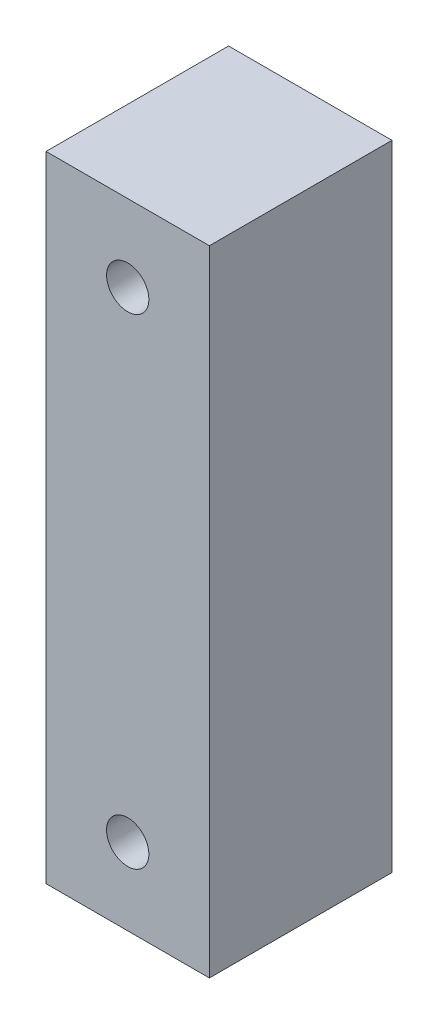
ISO-10303-21;
HEADER;
FILE_DESCRIPTION(('STEP AP214'),'2;1');
FILE_NAME('part.step','',(''),(''),'','','');
FILE_SCHEMA(('AUTOMOTIVE_DESIGN { 1 0 10303 214 1 1 1 1 }'));
ENDSEC;
DATA;
#1=APPLICATION_CONTEXT('core data for automotive mechanical design processes');
#2=APPLICATION_PROTOCOL_DEFINITION('international standard','automotive_design',2000,#1);
#3=PRODUCT_CONTEXT('',#1,'mechanical');
#4=PRODUCT('Part','Part','',(#3));
#5=PRODUCT_RELATED_PRODUCT_CATEGORY('part','',(#4));
#6=PRODUCT_DEFINITION_FORMATION('','',#4);
#7=PRODUCT_DEFINITION_CONTEXT('part definition',#1,'design');
#8=PRODUCT_DEFINITION('design','',#6,#7);
#9=PRODUCT_DEFINITION_SHAPE('','',#8);
#10=(LENGTH_UNIT() NAMED_UNIT(*) SI_UNIT(.MILLI.,.METRE.));
#11=(NAMED_UNIT(*) PLANE_ANGLE_UNIT() SI_UNIT($,.RADIAN.));
#12=(NAMED_UNIT(*) SI_UNIT($,.STERADIAN.) SOLID_ANGLE_UNIT());
#13=UNCERTAINTY_MEASURE_WITH_UNIT(LENGTH_MEASURE(1.E-05),#10,'distance_accuracy_value','');
#14=(GEOMETRIC_REPRESENTATION_CONTEXT(3) GLOBAL_UNCERTAINTY_ASSIGNED_CONTEXT((#13)) GLOBAL_UNIT_ASSIGNED_CONTEXT((#10,
#11,#12)) REPRESENTATION_CONTEXT('',''));
#15=CARTESIAN_POINT('',(0.,0.,0.));
#16=DIRECTION('',(0.,0.,1.));
#17=DIRECTION('',(1.,0.,0.));
#18=AXIS2_PLACEMENT_3D('',#15,#16,#17);
#19=CARTESIAN_POINT('',(85.,165.,-83.5));
#20=DIRECTION('',(0.,-1.,0.));
#21=DIRECTION('',(0.,0.,-1.));
#22=AXIS2_PLACEMENT_3D('',#19,#20,#21);
#23=PLANE('',#22);
#24=DIRECTION('',(0.,0.,1.));
#25=VECTOR('',#24,1.);
#26=CARTESIAN_POINT('',(0.,165.,-83.5));
#27=LINE('',#26,#25);
#28=CARTESIAN_POINT('',(0.,165.,-83.5));
#29=VERTEX_POINT('',#28);
#30=CARTESIAN_POINT('',(0.,165.,11.5));
#31=VERTEX_POINT('',#30);
#32=EDGE_CURVE('E107',#29,#31,#27,.T.);
#33=ORIENTED_EDGE('',*,*,#32,.T.);
#34=DIRECTION('',(-1.,0.,0.));
#35=VECTOR('',#34,1.);
#36=CARTESIAN_POINT('',(85.,165.,11.5));
#37=LINE('',#36,#35);
#38=CARTESIAN_POINT('',(85.,165.,11.5));
#39=VERTEX_POINT('',#38);
#40=EDGE_CURVE('E11',#39,#31,#37,.T.);
#41=ORIENTED_EDGE('',*,*,#40,.F.);
#42=DIRECTION('',(0.,0.,1.));
#43=VECTOR('',#42,1.);
#44=CARTESIAN_POINT('',(85.,165.,-83.5));
#45=LINE('',#44,#43);
#46=CARTESIAN_POINT('',(85.,165.,-83.5));
#47=VERTEX_POINT('',#46);
#48=EDGE_CURVE('E94',#47,#39,#45,.T.);
#49=ORIENTED_EDGE('',*,*,#48,.F.);
#50=DIRECTION('',(-1.,0.,0.));
#51=VECTOR('',#50,1.);
#52=CARTESIAN_POINT('',(85.,165.,-83.5));
#53=LINE('',#52,#51);
#54=EDGE_CURVE('E103',#47,#29,#53,.T.);
#55=ORIENTED_EDGE('',*,*,#54,.T.);
#56=EDGE_LOOP('',(#33,#41,#49,#55));
#57=FACE_BOUND('',#56,.T.);
#58=ADVANCED_FACE('F41',(#57),#23,.F.);
#59=CARTESIAN_POINT('',(85.,-165.,11.5));
#60=DIRECTION('',(0.,0.,-1.));
#61=DIRECTION('',(-1.,0.,0.));
#62=AXIS2_PLACEMENT_3D('',#59,#60,#61);
#63=PLANE('',#62);
#64=CARTESIAN_POINT('',(42.5,125.,11.5));
#65=DIRECTION('',(0.,0.,1.));
#66=DIRECTION('',(1.,0.,0.));
#67=AXIS2_PLACEMENT_3D('',#64,#65,#66);
#68=CIRCLE('',#67,11.);
#69=CARTESIAN_POINT('',(53.5,125.,11.5));
#70=VERTEX_POINT('',#69);
#71=EDGE_CURVE('E116',#70,#70,#68,.T.);
#72=ORIENTED_EDGE('',*,*,#71,.F.);
#73=EDGE_LOOP('',(#72));
#74=FACE_BOUND('',#73,.T.);
#75=CARTESIAN_POINT('',(42.5,-125.,11.5));
#76=DIRECTION('',(0.,0.,1.));
#77=DIRECTION('',(-1.,0.,0.));
#78=AXIS2_PLACEMENT_3D('',#75,#76,#77);
#79=CIRCLE('',#78,11.);
#80=CARTESIAN_POINT('',(31.5,-125.,11.5));
#81=VERTEX_POINT('',#80);
#82=EDGE_CURVE('E121',#81,#81,#79,.T.);
#83=ORIENTED_EDGE('',*,*,#82,.F.);
#84=EDGE_LOOP('',(#83));
#85=FACE_BOUND('',#84,.T.);
#86=DIRECTION('',(0.,-1.,0.));
#87=VECTOR('',#86,1.);
#88=CARTESIAN_POINT('',(0.,-165.,11.5));
#89=LINE('',#88,#87);
#90=CARTESIAN_POINT('',(0.,-165.,11.5));
#91=VERTEX_POINT('',#90);
#92=EDGE_CURVE('E98',#31,#91,#89,.T.);
#93=ORIENTED_EDGE('',*,*,#92,.T.);
#94=DIRECTION('',(-1.,0.,0.));
#95=VECTOR('',#94,1.);
#96=CARTESIAN_POINT('',(85.,-165.,11.5));
#97=LINE('',#96,#95);
#98=CARTESIAN_POINT('',(85.,-165.,11.5));
#99=VERTEX_POINT('',#98);
#100=EDGE_CURVE('E50',#99,#91,#97,.T.);
#101=ORIENTED_EDGE('',*,*,#100,.F.);
#102=DIRECTION('',(0.,-1.,0.));
#103=VECTOR('',#102,1.);
#104=CARTESIAN_POINT('',(85.,-165.,11.5));
#105=LINE('',#104,#103);
#106=EDGE_CURVE('E89',#39,#99,#105,.T.);
#107=ORIENTED_EDGE('',*,*,#106,.F.);
#108=ORIENTED_EDGE('',*,*,#40,.T.);
#109=EDGE_LOOP('',(#93,#101,#107,#108));
#110=FACE_BOUND('',#109,.T.);
#111=ADVANCED_FACE('F97',(#74,#85,#110),#63,.F.);
#112=CARTESIAN_POINT('',(85.,-165.,-83.4999999999999));
#113=DIRECTION('',(0.,1.,0.));
#114=DIRECTION('',(0.,0.,1.));
#115=AXIS2_PLACEMENT_3D('',#112,#113,#114);
#116=PLANE('',#115);
#117=DIRECTION('',(0.,0.,-1.));
#118=VECTOR('',#117,1.);
#119=CARTESIAN_POINT('',(0.,-165.,-83.4999999999999));
#120=LINE('',#119,#118);
#121=CARTESIAN_POINT('',(0.,-165.,-83.4999999999999));
#122=VERTEX_POINT('',#121);
#123=EDGE_CURVE('E76',#91,#122,#120,.T.);
#124=ORIENTED_EDGE('',*,*,#123,.T.);
#125=DIRECTION('',(-1.,0.,0.));
#126=VECTOR('',#125,1.);
#127=CARTESIAN_POINT('',(85.,-165.,-83.4999999999999));
#128=LINE('',#127,#126);
#129=CARTESIAN_POINT('',(85.,-165.,-83.4999999999999));
#130=VERTEX_POINT('',#129);
#131=EDGE_CURVE('E99',#130,#122,#128,.T.);
#132=ORIENTED_EDGE('',*,*,#131,.F.);
#133=DIRECTION('',(0.,0.,-1.));
#134=VECTOR('',#133,1.);
#135=CARTESIAN_POINT('',(85.,-165.,-83.4999999999999));
#136=LINE('',#135,#134);
#137=EDGE_CURVE('E92',#99,#130,#136,.T.);
#138=ORIENTED_EDGE('',*,*,#137,.F.);
#139=ORIENTED_EDGE('',*,*,#100,.T.);
#140=EDGE_LOOP('',(#124,#132,#138,#139));
#141=FACE_BOUND('',#140,.T.);
#142=ADVANCED_FACE('F101',(#141),#116,.F.);
#143=CARTESIAN_POINT('',(85.,-165.,-83.4999999999999));
#144=DIRECTION('',(0.,0.,1.));
#145=DIRECTION('',(0.,-1.,0.));
#146=AXIS2_PLACEMENT_3D('',#143,#144,#145);
#147=PLANE('',#146);
#148=CARTESIAN_POINT('',(42.5,125.,-83.5));
#149=DIRECTION('',(0.,0.,1.));
#150=DIRECTION('',(0.,-1.,0.));
#151=AXIS2_PLACEMENT_3D('',#148,#149,#150);
#152=CIRCLE('',#151,11.);
#153=CARTESIAN_POINT('',(42.5,114.,-83.5));
#154=VERTEX_POINT('',#153);
#155=EDGE_CURVE('E44',#154,#154,#152,.T.);
#156=ORIENTED_EDGE('',*,*,#155,.T.);
#157=EDGE_LOOP('',(#156));
#158=FACE_BOUND('',#157,.T.);
#159=CARTESIAN_POINT('',(42.5,-125.,-83.5));
#160=DIRECTION('',(0.,0.,1.));
#161=DIRECTION('',(0.,-1.,0.));
#162=AXIS2_PLACEMENT_3D('',#159,#160,#161);
#163=CIRCLE('',#162,11.);
#164=CARTESIAN_POINT('',(42.5,-136.,-83.5));
#165=VERTEX_POINT('',#164);
#166=EDGE_CURVE('E114',#165,#165,#163,.T.);
#167=ORIENTED_EDGE('',*,*,#166,.T.);
#168=EDGE_LOOP('',(#167));
#169=FACE_BOUND('',#168,.T.);
#170=DIRECTION('',(0.,1.,0.));
#171=VECTOR('',#170,1.);
#172=CARTESIAN_POINT('',(0.,-165.,-83.4999999999999));
#173=LINE('',#172,#171);
#174=EDGE_CURVE('E82',#122,#29,#173,.T.);
#175=ORIENTED_EDGE('',*,*,#174,.T.);
#176=ORIENTED_EDGE('',*,*,#54,.F.);
#177=DIRECTION('',(0.,1.,0.));
#178=VECTOR('',#177,1.);
#179=CARTESIAN_POINT('',(85.,-165.,-83.4999999999999));
#180=LINE('',#179,#178);
#181=EDGE_CURVE('E59',#130,#47,#180,.T.);
#182=ORIENTED_EDGE('',*,*,#181,.F.);
#183=ORIENTED_EDGE('',*,*,#131,.T.);
#184=EDGE_LOOP('',(#175,#176,#182,#183));
#185=FACE_BOUND('',#184,.T.);
#186=ADVANCED_FACE('F139',(#158,#169,#185),#147,.F.);
#187=CARTESIAN_POINT('',(85.,0.,0.));
#188=DIRECTION('',(-1.,0.,0.));
#189=DIRECTION('',(0.,0.,1.));
#190=AXIS2_PLACEMENT_3D('',#187,#188,#189);
#191=PLANE('',#190);
#192=ORIENTED_EDGE('',*,*,#48,.T.);
#193=ORIENTED_EDGE('',*,*,#106,.T.);
#194=ORIENTED_EDGE('',*,*,#137,.T.);
#195=ORIENTED_EDGE('',*,*,#181,.T.);
#196=EDGE_LOOP('',(#192,#193,#194,#195));
#197=FACE_BOUND('',#196,.T.);
#198=ADVANCED_FACE('F90',(#197),#191,.F.);
#199=CARTESIAN_POINT('',(0.,0.,0.));
#200=DIRECTION('',(-1.,0.,0.));
#201=DIRECTION('',(0.,0.,1.));
#202=AXIS2_PLACEMENT_3D('',#199,#200,#201);
#203=PLANE('',#202);
#204=ORIENTED_EDGE('',*,*,#32,.F.);
#205=ORIENTED_EDGE('',*,*,#174,.F.);
#206=ORIENTED_EDGE('',*,*,#123,.F.);
#207=ORIENTED_EDGE('',*,*,#92,.F.);
#208=EDGE_LOOP('',(#204,#205,#206,#207));
#209=FACE_BOUND('',#208,.T.);
#210=ADVANCED_FACE('F146',(#209),#203,.T.);
#211=CARTESIAN_POINT('',(42.5,-125.,-138.5));
#212=DIRECTION('',(0.,0.,1.));
#213=DIRECTION('',(1.,0.,0.));
#214=AXIS2_PLACEMENT_3D('',#211,#212,#213);
#215=CYLINDRICAL_SURFACE('',#214,11.);
#216=ORIENTED_EDGE('',*,*,#82,.T.);
#217=EDGE_LOOP('',(#216));
#218=FACE_BOUND('',#217,.T.);
#219=ORIENTED_EDGE('',*,*,#166,.F.);
#220=EDGE_LOOP('',(#219));
#221=FACE_BOUND('',#220,.T.);
#222=ADVANCED_FACE('F129',(#218,#221),#215,.F.);
#223=CARTESIAN_POINT('',(42.5,125.,-138.5));
#224=DIRECTION('',(0.,0.,1.));
#225=DIRECTION('',(1.,0.,0.));
#226=AXIS2_PLACEMENT_3D('',#223,#224,#225);
#227=CYLINDRICAL_SURFACE('',#226,11.);
#228=ORIENTED_EDGE('',*,*,#71,.T.);
#229=EDGE_LOOP('',(#228));
#230=FACE_BOUND('',#229,.T.);
#231=ORIENTED_EDGE('',*,*,#155,.F.);
#232=EDGE_LOOP('',(#231));
#233=FACE_BOUND('',#232,.T.);
#234=ADVANCED_FACE('F153',(#230,#233),#227,.F.);
#235=CLOSED_SHELL('',(#58,#111,#142,#186,#198,#210,#222,#234));
#236=MANIFOLD_SOLID_BREP('B2',#235);
#237=ADVANCED_BREP_SHAPE_REPRESENTATION('',(#18,#236),#14);
#238=SHAPE_DEFINITION_REPRESENTATION(#9,#237);
ENDSEC;
END-ISO-10303-21;
